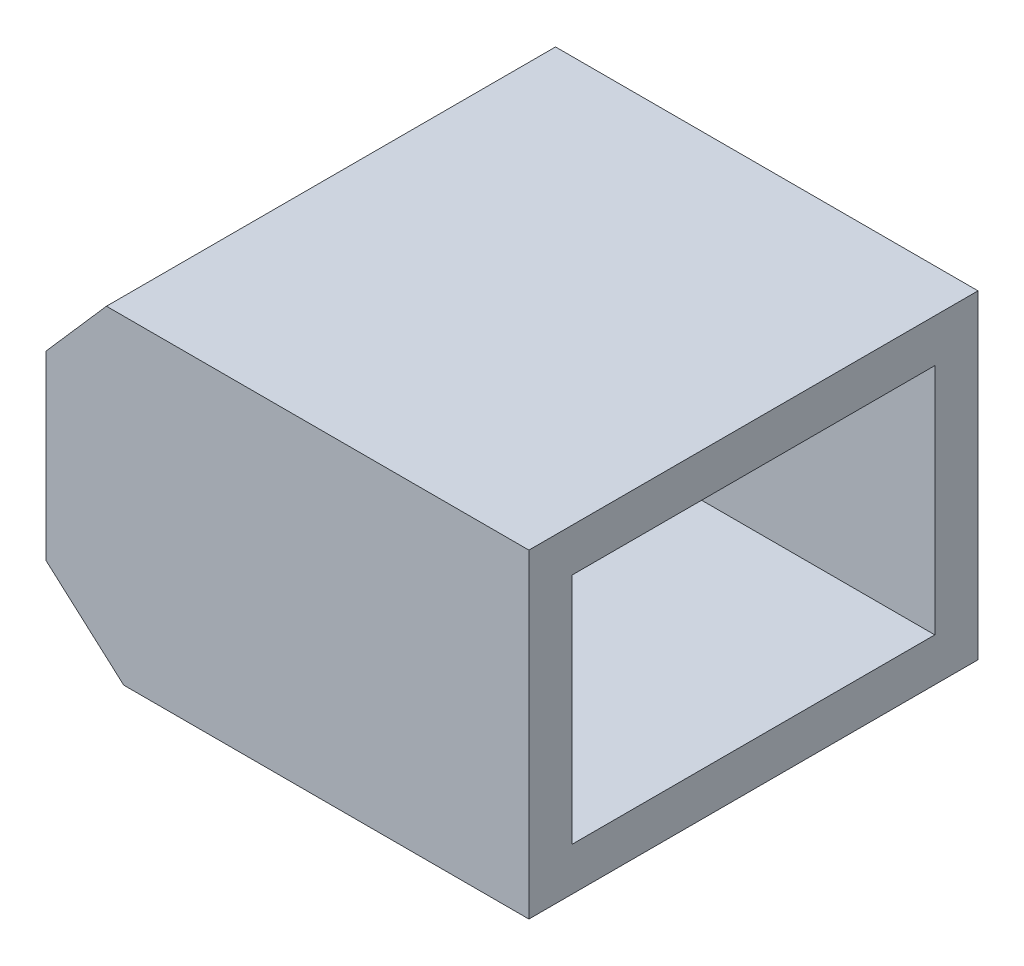
ISO-10303-21;
HEADER;
FILE_DESCRIPTION(('STEP AP214'),'2;1');
FILE_NAME('part.step','',(''),(''),'','','');
FILE_SCHEMA(('AUTOMOTIVE_DESIGN { 1 0 10303 214 1 1 1 1 }'));
ENDSEC;
DATA;
#1=APPLICATION_CONTEXT('core data for automotive mechanical design processes');
#2=APPLICATION_PROTOCOL_DEFINITION('international standard','automotive_design',2000,#1);
#3=PRODUCT_CONTEXT('',#1,'mechanical');
#4=PRODUCT('Part','Part','',(#3));
#5=PRODUCT_RELATED_PRODUCT_CATEGORY('part','',(#4));
#6=PRODUCT_DEFINITION_FORMATION('','',#4);
#7=PRODUCT_DEFINITION_CONTEXT('part definition',#1,'design');
#8=PRODUCT_DEFINITION('design','',#6,#7);
#9=PRODUCT_DEFINITION_SHAPE('','',#8);
#10=(LENGTH_UNIT() NAMED_UNIT(*) SI_UNIT(.MILLI.,.METRE.));
#11=(NAMED_UNIT(*) PLANE_ANGLE_UNIT() SI_UNIT($,.RADIAN.));
#12=(NAMED_UNIT(*) SI_UNIT($,.STERADIAN.) SOLID_ANGLE_UNIT());
#13=UNCERTAINTY_MEASURE_WITH_UNIT(LENGTH_MEASURE(1.E-05),#10,'distance_accuracy_value','');
#14=(GEOMETRIC_REPRESENTATION_CONTEXT(3) GLOBAL_UNCERTAINTY_ASSIGNED_CONTEXT((#13)) GLOBAL_UNIT_ASSIGNED_CONTEXT((#10,
#11,#12)) REPRESENTATION_CONTEXT('',''));
#15=CARTESIAN_POINT('',(0.,0.,0.));
#16=DIRECTION('',(0.,0.,1.));
#17=DIRECTION('',(1.,0.,0.));
#18=AXIS2_PLACEMENT_3D('',#15,#16,#17);
#19=CARTESIAN_POINT('',(0.915165952785248,-37.,52.));
#20=DIRECTION('',(-1.,0.,0.));
#21=DIRECTION('',(0.,0.,1.));
#22=AXIS2_PLACEMENT_3D('',#19,#20,#21);
#23=PLANE('',#22);
#24=DIRECTION('',(0.,1.,0.));
#25=VECTOR('',#24,1.);
#26=CARTESIAN_POINT('',(0.915165952785248,-37.,0.));
#27=LINE('',#26,#25);
#28=CARTESIAN_POINT('',(0.915165952785248,-37.,0.));
#29=VERTEX_POINT('',#28);
#30=CARTESIAN_POINT('',(0.915165952785248,0.,0.));
#31=VERTEX_POINT('',#30);
#32=EDGE_CURVE('E135',#29,#31,#27,.T.);
#33=ORIENTED_EDGE('',*,*,#32,.T.);
#34=DIRECTION('',(0.,0.,-1.));
#35=VECTOR('',#34,1.);
#36=CARTESIAN_POINT('',(0.915165952785248,0.,52.));
#37=LINE('',#36,#35);
#38=CARTESIAN_POINT('',(0.915165952785248,0.,52.));
#39=VERTEX_POINT('',#38);
#40=EDGE_CURVE('E11',#39,#31,#37,.T.);
#41=ORIENTED_EDGE('',*,*,#40,.F.);
#42=DIRECTION('',(0.,1.,0.));
#43=VECTOR('',#42,1.);
#44=CARTESIAN_POINT('',(0.915165952785248,-37.,52.));
#45=LINE('',#44,#43);
#46=CARTESIAN_POINT('',(0.915165952785248,-37.,52.));
#47=VERTEX_POINT('',#46);
#48=EDGE_CURVE('E147',#47,#39,#45,.T.);
#49=ORIENTED_EDGE('',*,*,#48,.F.);
#50=DIRECTION('',(0.,0.,-1.));
#51=VECTOR('',#50,1.);
#52=CARTESIAN_POINT('',(0.915165952785248,-37.,52.));
#53=LINE('',#52,#51);
#54=EDGE_CURVE('E131',#47,#29,#53,.T.);
#55=ORIENTED_EDGE('',*,*,#54,.T.);
#56=EDGE_LOOP('',(#33,#41,#49,#55));
#57=FACE_BOUND('',#56,.T.);
#58=DIRECTION('',(0.,1.,0.));
#59=VECTOR('',#58,1.);
#60=CARTESIAN_POINT('',(0.915165952785248,-37.,5.));
#61=LINE('',#60,#59);
#62=CARTESIAN_POINT('',(0.915165952785248,-32.,5.));
#63=VERTEX_POINT('',#62);
#64=CARTESIAN_POINT('',(0.915165952785248,-5.,5.));
#65=VERTEX_POINT('',#64);
#66=EDGE_CURVE('E165',#63,#65,#61,.T.);
#67=ORIENTED_EDGE('',*,*,#66,.F.);
#68=DIRECTION('',(0.,0.,-1.));
#69=VECTOR('',#68,1.);
#70=CARTESIAN_POINT('',(0.915165952785248,-32.,52.));
#71=LINE('',#70,#69);
#72=CARTESIAN_POINT('',(0.915165952785248,-32.,47.));
#73=VERTEX_POINT('',#72);
#74=EDGE_CURVE('E169',#73,#63,#71,.T.);
#75=ORIENTED_EDGE('',*,*,#74,.F.);
#76=DIRECTION('',(0.,1.,0.));
#77=VECTOR('',#76,1.);
#78=CARTESIAN_POINT('',(0.915165952785248,-37.,47.));
#79=LINE('',#78,#77);
#80=CARTESIAN_POINT('',(0.915165952785248,-5.,47.));
#81=VERTEX_POINT('',#80);
#82=EDGE_CURVE('E53',#73,#81,#79,.T.);
#83=ORIENTED_EDGE('',*,*,#82,.T.);
#84=DIRECTION('',(0.,0.,-1.));
#85=VECTOR('',#84,1.);
#86=CARTESIAN_POINT('',(0.915165952785248,-5.,52.));
#87=LINE('',#86,#85);
#88=EDGE_CURVE('E139',#81,#65,#87,.T.);
#89=ORIENTED_EDGE('',*,*,#88,.T.);
#90=EDGE_LOOP('',(#67,#75,#83,#89));
#91=FACE_BOUND('',#90,.T.);
#92=ADVANCED_FACE('F39',(#57,#91),#23,.F.);
#93=CARTESIAN_POINT('',(0.915165952785248,0.,52.));
#94=DIRECTION('',(0.,-1.,0.));
#95=DIRECTION('',(0.,0.,-1.));
#96=AXIS2_PLACEMENT_3D('',#93,#94,#95);
#97=PLANE('',#96);
#98=DIRECTION('',(-1.,0.,0.));
#99=VECTOR('',#98,1.);
#100=CARTESIAN_POINT('',(0.915165952785248,0.,0.));
#101=LINE('',#100,#99);
#102=CARTESIAN_POINT('',(-48.,0.,0.));
#103=VERTEX_POINT('',#102);
#104=EDGE_CURVE('E138',#31,#103,#101,.T.);
#105=ORIENTED_EDGE('',*,*,#104,.T.);
#106=DIRECTION('',(0.,0.,-1.));
#107=VECTOR('',#106,1.);
#108=CARTESIAN_POINT('',(-48.,0.,52.));
#109=LINE('',#108,#107);
#110=CARTESIAN_POINT('',(-48.,0.,52.));
#111=VERTEX_POINT('',#110);
#112=EDGE_CURVE('E46',#111,#103,#109,.T.);
#113=ORIENTED_EDGE('',*,*,#112,.F.);
#114=DIRECTION('',(-1.,0.,0.));
#115=VECTOR('',#114,1.);
#116=CARTESIAN_POINT('',(0.915165952785248,0.,52.));
#117=LINE('',#116,#115);
#118=EDGE_CURVE('E97',#39,#111,#117,.T.);
#119=ORIENTED_EDGE('',*,*,#118,.F.);
#120=ORIENTED_EDGE('',*,*,#40,.T.);
#121=EDGE_LOOP('',(#105,#113,#119,#120));
#122=FACE_BOUND('',#121,.T.);
#123=ADVANCED_FACE('F256',(#122),#97,.F.);
#124=CARTESIAN_POINT('',(-48.,0.,52.));
#125=DIRECTION('',(0.752576694706878,-0.658504607868518,0.));
#126=DIRECTION('',(0.658504607868518,0.752576694706878,0.));
#127=AXIS2_PLACEMENT_3D('',#124,#125,#126);
#128=PLANE('',#127);
#129=DIRECTION('',(-0.658504607868518,-0.752576694706878,0.));
#130=VECTOR('',#129,1.);
#131=CARTESIAN_POINT('',(-48.,0.,0.));
#132=LINE('',#131,#130);
#133=CARTESIAN_POINT('',(-55.,-8.,0.));
#134=VERTEX_POINT('',#133);
#135=EDGE_CURVE('E141',#103,#134,#132,.T.);
#136=ORIENTED_EDGE('',*,*,#135,.T.);
#137=DIRECTION('',(0.,0.,-1.));
#138=VECTOR('',#137,1.);
#139=CARTESIAN_POINT('',(-55.,-8.,52.));
#140=LINE('',#139,#138);
#141=CARTESIAN_POINT('',(-55.,-8.,52.));
#142=VERTEX_POINT('',#141);
#143=EDGE_CURVE('E126',#142,#134,#140,.T.);
#144=ORIENTED_EDGE('',*,*,#143,.F.);
#145=DIRECTION('',(-0.658504607868518,-0.752576694706878,0.));
#146=VECTOR('',#145,1.);
#147=CARTESIAN_POINT('',(-48.,0.,52.));
#148=LINE('',#147,#146);
#149=EDGE_CURVE('E114',#111,#142,#148,.T.);
#150=ORIENTED_EDGE('',*,*,#149,.F.);
#151=ORIENTED_EDGE('',*,*,#112,.T.);
#152=EDGE_LOOP('',(#136,#144,#150,#151));
#153=FACE_BOUND('',#152,.T.);
#154=ADVANCED_FACE('F153',(#153),#128,.F.);
#155=CARTESIAN_POINT('',(-55.,-8.,52.));
#156=DIRECTION('',(1.,0.,0.));
#157=DIRECTION('',(0.,0.,-1.));
#158=AXIS2_PLACEMENT_3D('',#155,#156,#157);
#159=PLANE('',#158);
#160=DIRECTION('',(0.,-1.,0.));
#161=VECTOR('',#160,1.);
#162=CARTESIAN_POINT('',(-55.,-8.,0.));
#163=LINE('',#162,#161);
#164=CARTESIAN_POINT('',(-55.,-29.,0.));
#165=VERTEX_POINT('',#164);
#166=EDGE_CURVE('E123',#134,#165,#163,.T.);
#167=ORIENTED_EDGE('',*,*,#166,.T.);
#168=DIRECTION('',(0.,0.,-1.));
#169=VECTOR('',#168,1.);
#170=CARTESIAN_POINT('',(-55.,-29.,52.));
#171=LINE('',#170,#169);
#172=CARTESIAN_POINT('',(-55.,-29.,52.));
#173=VERTEX_POINT('',#172);
#174=EDGE_CURVE('E120',#173,#165,#171,.T.);
#175=ORIENTED_EDGE('',*,*,#174,.F.);
#176=DIRECTION('',(0.,-1.,0.));
#177=VECTOR('',#176,1.);
#178=CARTESIAN_POINT('',(-55.,-8.,52.));
#179=LINE('',#178,#177);
#180=EDGE_CURVE('E107',#142,#173,#179,.T.);
#181=ORIENTED_EDGE('',*,*,#180,.F.);
#182=ORIENTED_EDGE('',*,*,#143,.T.);
#183=EDGE_LOOP('',(#167,#175,#181,#182));
#184=FACE_BOUND('',#183,.T.);
#185=ADVANCED_FACE('F121',(#184),#159,.F.);
#186=CARTESIAN_POINT('',(-55.,-29.,52.));
#187=DIRECTION('',(0.66436383882992,0.74740931868366,0.));
#188=DIRECTION('',(-0.74740931868366,0.66436383882992,0.));
#189=AXIS2_PLACEMENT_3D('',#186,#187,#188);
#190=PLANE('',#189);
#191=DIRECTION('',(0.74740931868366,-0.66436383882992,0.));
#192=VECTOR('',#191,1.);
#193=CARTESIAN_POINT('',(-55.,-29.,0.));
#194=LINE('',#193,#192);
#195=CARTESIAN_POINT('',(-46.,-37.,0.));
#196=VERTEX_POINT('',#195);
#197=EDGE_CURVE('E144',#165,#196,#194,.T.);
#198=ORIENTED_EDGE('',*,*,#197,.T.);
#199=DIRECTION('',(0.,0.,-1.));
#200=VECTOR('',#199,1.);
#201=CARTESIAN_POINT('',(-46.,-37.,52.));
#202=LINE('',#201,#200);
#203=CARTESIAN_POINT('',(-46.,-37.,52.));
#204=VERTEX_POINT('',#203);
#205=EDGE_CURVE('E127',#204,#196,#202,.T.);
#206=ORIENTED_EDGE('',*,*,#205,.F.);
#207=DIRECTION('',(0.74740931868366,-0.66436383882992,0.));
#208=VECTOR('',#207,1.);
#209=CARTESIAN_POINT('',(-55.,-29.,52.));
#210=LINE('',#209,#208);
#211=EDGE_CURVE('E111',#173,#204,#210,.T.);
#212=ORIENTED_EDGE('',*,*,#211,.F.);
#213=ORIENTED_EDGE('',*,*,#174,.T.);
#214=EDGE_LOOP('',(#198,#206,#212,#213));
#215=FACE_BOUND('',#214,.T.);
#216=ADVANCED_FACE('F129',(#215),#190,.F.);
#217=CARTESIAN_POINT('',(-46.,-37.,52.));
#218=DIRECTION('',(0.,1.,0.));
#219=DIRECTION('',(0.,0.,1.));
#220=AXIS2_PLACEMENT_3D('',#217,#218,#219);
#221=PLANE('',#220);
#222=DIRECTION('',(1.,0.,0.));
#223=VECTOR('',#222,1.);
#224=CARTESIAN_POINT('',(-46.,-37.,0.));
#225=LINE('',#224,#223);
#226=EDGE_CURVE('E89',#196,#29,#225,.T.);
#227=ORIENTED_EDGE('',*,*,#226,.T.);
#228=ORIENTED_EDGE('',*,*,#54,.F.);
#229=DIRECTION('',(1.,0.,0.));
#230=VECTOR('',#229,1.);
#231=CARTESIAN_POINT('',(-46.,-37.,52.));
#232=LINE('',#231,#230);
#233=EDGE_CURVE('E62',#204,#47,#232,.T.);
#234=ORIENTED_EDGE('',*,*,#233,.F.);
#235=ORIENTED_EDGE('',*,*,#205,.T.);
#236=EDGE_LOOP('',(#227,#228,#234,#235));
#237=FACE_BOUND('',#236,.T.);
#238=ADVANCED_FACE('F157',(#237),#221,.F.);
#239=CARTESIAN_POINT('',(0.,0.,52.));
#240=DIRECTION('',(0.,0.,1.));
#241=DIRECTION('',(1.,0.,0.));
#242=AXIS2_PLACEMENT_3D('',#239,#240,#241);
#243=PLANE('',#242);
#244=ORIENTED_EDGE('',*,*,#48,.T.);
#245=ORIENTED_EDGE('',*,*,#118,.T.);
#246=ORIENTED_EDGE('',*,*,#149,.T.);
#247=ORIENTED_EDGE('',*,*,#180,.T.);
#248=ORIENTED_EDGE('',*,*,#211,.T.);
#249=ORIENTED_EDGE('',*,*,#233,.T.);
#250=EDGE_LOOP('',(#244,#245,#246,#247,#248,#249));
#251=FACE_BOUND('',#250,.T.);
#252=ADVANCED_FACE('F109',(#251),#243,.T.);
#253=CARTESIAN_POINT('',(0.,0.,0.));
#254=DIRECTION('',(0.,0.,1.));
#255=DIRECTION('',(1.,0.,0.));
#256=AXIS2_PLACEMENT_3D('',#253,#254,#255);
#257=PLANE('',#256);
#258=ORIENTED_EDGE('',*,*,#32,.F.);
#259=ORIENTED_EDGE('',*,*,#226,.F.);
#260=ORIENTED_EDGE('',*,*,#197,.F.);
#261=ORIENTED_EDGE('',*,*,#166,.F.);
#262=ORIENTED_EDGE('',*,*,#135,.F.);
#263=ORIENTED_EDGE('',*,*,#104,.F.);
#264=EDGE_LOOP('',(#258,#259,#260,#261,#262,#263));
#265=FACE_BOUND('',#264,.T.);
#266=ADVANCED_FACE('F156',(#265),#257,.F.);
#267=CARTESIAN_POINT('',(0.915165952785248,-5.,52.));
#268=DIRECTION('',(0.,-1.,0.));
#269=DIRECTION('',(0.,0.,-1.));
#270=AXIS2_PLACEMENT_3D('',#267,#268,#269);
#271=PLANE('',#270);
#272=DIRECTION('',(-1.,0.,0.));
#273=VECTOR('',#272,1.);
#274=CARTESIAN_POINT('',(0.915165952785248,-5.,5.));
#275=LINE('',#274,#273);
#276=CARTESIAN_POINT('',(-45.7311588670408,-5.,5.));
#277=VERTEX_POINT('',#276);
#278=EDGE_CURVE('E168',#65,#277,#275,.T.);
#279=ORIENTED_EDGE('',*,*,#278,.F.);
#280=ORIENTED_EDGE('',*,*,#88,.F.);
#281=DIRECTION('',(-1.,0.,0.));
#282=VECTOR('',#281,1.);
#283=CARTESIAN_POINT('',(0.915165952785248,-5.,47.));
#284=LINE('',#283,#282);
#285=CARTESIAN_POINT('',(-45.7311588670408,-5.,47.));
#286=VERTEX_POINT('',#285);
#287=EDGE_CURVE('E175',#81,#286,#284,.T.);
#288=ORIENTED_EDGE('',*,*,#287,.T.);
#289=DIRECTION('',(0.,0.,-1.));
#290=VECTOR('',#289,1.);
#291=CARTESIAN_POINT('',(-45.7311588670408,-5.,52.));
#292=LINE('',#291,#290);
#293=EDGE_CURVE('E179',#286,#277,#292,.T.);
#294=ORIENTED_EDGE('',*,*,#293,.T.);
#295=EDGE_LOOP('',(#279,#280,#288,#294));
#296=FACE_BOUND('',#295,.T.);
#297=ADVANCED_FACE('F225',(#296),#271,.T.);
#298=CARTESIAN_POINT('',(-44.2371165264656,-3.29252303934259,52.));
#299=DIRECTION('',(0.752576694706878,-0.658504607868518,0.));
#300=DIRECTION('',(0.658504607868518,0.752576694706878,0.));
#301=AXIS2_PLACEMENT_3D('',#298,#299,#300);
#302=PLANE('',#301);
#303=DIRECTION('',(-0.658504607868518,-0.752576694706878,0.));
#304=VECTOR('',#303,1.);
#305=CARTESIAN_POINT('',(-44.2371165264656,-3.29252303934259,5.));
#306=LINE('',#305,#304);
#307=CARTESIAN_POINT('',(-50.,-9.87867558052475,5.));
#308=VERTEX_POINT('',#307);
#309=EDGE_CURVE('E202',#277,#308,#306,.T.);
#310=ORIENTED_EDGE('',*,*,#309,.F.);
#311=ORIENTED_EDGE('',*,*,#293,.F.);
#312=DIRECTION('',(-0.658504607868518,-0.752576694706878,0.));
#313=VECTOR('',#312,1.);
#314=CARTESIAN_POINT('',(-44.2371165264656,-3.29252303934259,47.));
#315=LINE('',#314,#313);
#316=CARTESIAN_POINT('',(-50.,-9.87867558052475,47.));
#317=VERTEX_POINT('',#316);
#318=EDGE_CURVE('E196',#286,#317,#315,.T.);
#319=ORIENTED_EDGE('',*,*,#318,.T.);
#320=DIRECTION('',(0.,0.,-1.));
#321=VECTOR('',#320,1.);
#322=CARTESIAN_POINT('',(-50.,-9.87867558052475,52.));
#323=LINE('',#322,#321);
#324=EDGE_CURVE('E199',#317,#308,#323,.T.);
#325=ORIENTED_EDGE('',*,*,#324,.T.);
#326=EDGE_LOOP('',(#310,#311,#319,#325));
#327=FACE_BOUND('',#326,.T.);
#328=ADVANCED_FACE('F229',(#327),#302,.T.);
#329=CARTESIAN_POINT('',(-50.,-8.,52.));
#330=DIRECTION('',(1.,0.,0.));
#331=DIRECTION('',(0.,0.,-1.));
#332=AXIS2_PLACEMENT_3D('',#329,#330,#331);
#333=PLANE('',#332);
#334=DIRECTION('',(0.,-1.,0.));
#335=VECTOR('',#334,1.);
#336=CARTESIAN_POINT('',(-50.,-8.,5.));
#337=LINE('',#336,#335);
#338=CARTESIAN_POINT('',(-50.,-26.7546696784487,5.));
#339=VERTEX_POINT('',#338);
#340=EDGE_CURVE('E193',#308,#339,#337,.T.);
#341=ORIENTED_EDGE('',*,*,#340,.F.);
#342=ORIENTED_EDGE('',*,*,#324,.F.);
#343=DIRECTION('',(0.,-1.,0.));
#344=VECTOR('',#343,1.);
#345=CARTESIAN_POINT('',(-50.,-8.,47.));
#346=LINE('',#345,#344);
#347=CARTESIAN_POINT('',(-50.,-26.7546696784487,47.));
#348=VERTEX_POINT('',#347);
#349=EDGE_CURVE('E187',#317,#348,#346,.T.);
#350=ORIENTED_EDGE('',*,*,#349,.T.);
#351=DIRECTION('',(0.,0.,-1.));
#352=VECTOR('',#351,1.);
#353=CARTESIAN_POINT('',(-50.,-26.7546696784487,52.));
#354=LINE('',#353,#352);
#355=EDGE_CURVE('E190',#348,#339,#354,.T.);
#356=ORIENTED_EDGE('',*,*,#355,.T.);
#357=EDGE_LOOP('',(#341,#342,#350,#356));
#358=FACE_BOUND('',#357,.T.);
#359=ADVANCED_FACE('F237',(#358),#333,.T.);
#360=CARTESIAN_POINT('',(-51.6781808058504,-25.2629534065817,52.));
#361=DIRECTION('',(0.66436383882992,0.74740931868366,0.));
#362=DIRECTION('',(-0.74740931868366,0.66436383882992,0.));
#363=AXIS2_PLACEMENT_3D('',#360,#361,#362);
#364=PLANE('',#363);
#365=DIRECTION('',(0.74740931868366,-0.66436383882992,0.));
#366=VECTOR('',#365,1.);
#367=CARTESIAN_POINT('',(-51.6781808058504,-25.2629534065817,5.));
#368=LINE('',#367,#366);
#369=CARTESIAN_POINT('',(-44.0990033882548,-32.,5.));
#370=VERTEX_POINT('',#369);
#371=EDGE_CURVE('E184',#339,#370,#368,.T.);
#372=ORIENTED_EDGE('',*,*,#371,.F.);
#373=ORIENTED_EDGE('',*,*,#355,.F.);
#374=DIRECTION('',(0.74740931868366,-0.66436383882992,0.));
#375=VECTOR('',#374,1.);
#376=CARTESIAN_POINT('',(-51.6781808058504,-25.2629534065817,47.));
#377=LINE('',#376,#375);
#378=CARTESIAN_POINT('',(-44.0990033882548,-32.,47.));
#379=VERTEX_POINT('',#378);
#380=EDGE_CURVE('E181',#348,#379,#377,.T.);
#381=ORIENTED_EDGE('',*,*,#380,.T.);
#382=DIRECTION('',(0.,0.,-1.));
#383=VECTOR('',#382,1.);
#384=CARTESIAN_POINT('',(-44.0990033882548,-32.,52.));
#385=LINE('',#384,#383);
#386=EDGE_CURVE('E172',#379,#370,#385,.T.);
#387=ORIENTED_EDGE('',*,*,#386,.T.);
#388=EDGE_LOOP('',(#372,#373,#381,#387));
#389=FACE_BOUND('',#388,.T.);
#390=ADVANCED_FACE('F282',(#389),#364,.T.);
#391=CARTESIAN_POINT('',(-46.,-32.,52.));
#392=DIRECTION('',(0.,1.,0.));
#393=DIRECTION('',(0.,0.,1.));
#394=AXIS2_PLACEMENT_3D('',#391,#392,#393);
#395=PLANE('',#394);
#396=DIRECTION('',(1.,0.,0.));
#397=VECTOR('',#396,1.);
#398=CARTESIAN_POINT('',(-46.,-32.,5.));
#399=LINE('',#398,#397);
#400=EDGE_CURVE('E176',#370,#63,#399,.T.);
#401=ORIENTED_EDGE('',*,*,#400,.F.);
#402=ORIENTED_EDGE('',*,*,#386,.F.);
#403=DIRECTION('',(1.,0.,0.));
#404=VECTOR('',#403,1.);
#405=CARTESIAN_POINT('',(-46.,-32.,47.));
#406=LINE('',#405,#404);
#407=EDGE_CURVE('E173',#379,#73,#406,.T.);
#408=ORIENTED_EDGE('',*,*,#407,.T.);
#409=ORIENTED_EDGE('',*,*,#74,.T.);
#410=EDGE_LOOP('',(#401,#402,#408,#409));
#411=FACE_BOUND('',#410,.T.);
#412=ADVANCED_FACE('F254',(#411),#395,.T.);
#413=CARTESIAN_POINT('',(0.,0.,47.));
#414=DIRECTION('',(0.,0.,1.));
#415=DIRECTION('',(1.,0.,0.));
#416=AXIS2_PLACEMENT_3D('',#413,#414,#415);
#417=PLANE('',#416);
#418=ORIENTED_EDGE('',*,*,#82,.F.);
#419=ORIENTED_EDGE('',*,*,#407,.F.);
#420=ORIENTED_EDGE('',*,*,#380,.F.);
#421=ORIENTED_EDGE('',*,*,#349,.F.);
#422=ORIENTED_EDGE('',*,*,#318,.F.);
#423=ORIENTED_EDGE('',*,*,#287,.F.);
#424=EDGE_LOOP('',(#418,#419,#420,#421,#422,#423));
#425=FACE_BOUND('',#424,.T.);
#426=ADVANCED_FACE('F277',(#425),#417,.F.);
#427=CARTESIAN_POINT('',(0.,0.,5.));
#428=DIRECTION('',(0.,0.,1.));
#429=DIRECTION('',(1.,0.,0.));
#430=AXIS2_PLACEMENT_3D('',#427,#428,#429);
#431=PLANE('',#430);
#432=ORIENTED_EDGE('',*,*,#66,.T.);
#433=ORIENTED_EDGE('',*,*,#278,.T.);
#434=ORIENTED_EDGE('',*,*,#309,.T.);
#435=ORIENTED_EDGE('',*,*,#340,.T.);
#436=ORIENTED_EDGE('',*,*,#371,.T.);
#437=ORIENTED_EDGE('',*,*,#400,.T.);
#438=EDGE_LOOP('',(#432,#433,#434,#435,#436,#437));
#439=FACE_BOUND('',#438,.T.);
#440=ADVANCED_FACE('F217',(#439),#431,.T.);
#441=CLOSED_SHELL('',(#92,#123,#154,#185,#216,#238,#252,#266,#297,#328,#359,#390,#412,#426,#440));
#442=MANIFOLD_SOLID_BREP('B2',#441);
#443=ADVANCED_BREP_SHAPE_REPRESENTATION('',(#18,#442),#14);
#444=SHAPE_DEFINITION_REPRESENTATION(#9,#443);
ENDSEC;
END-ISO-10303-21;
